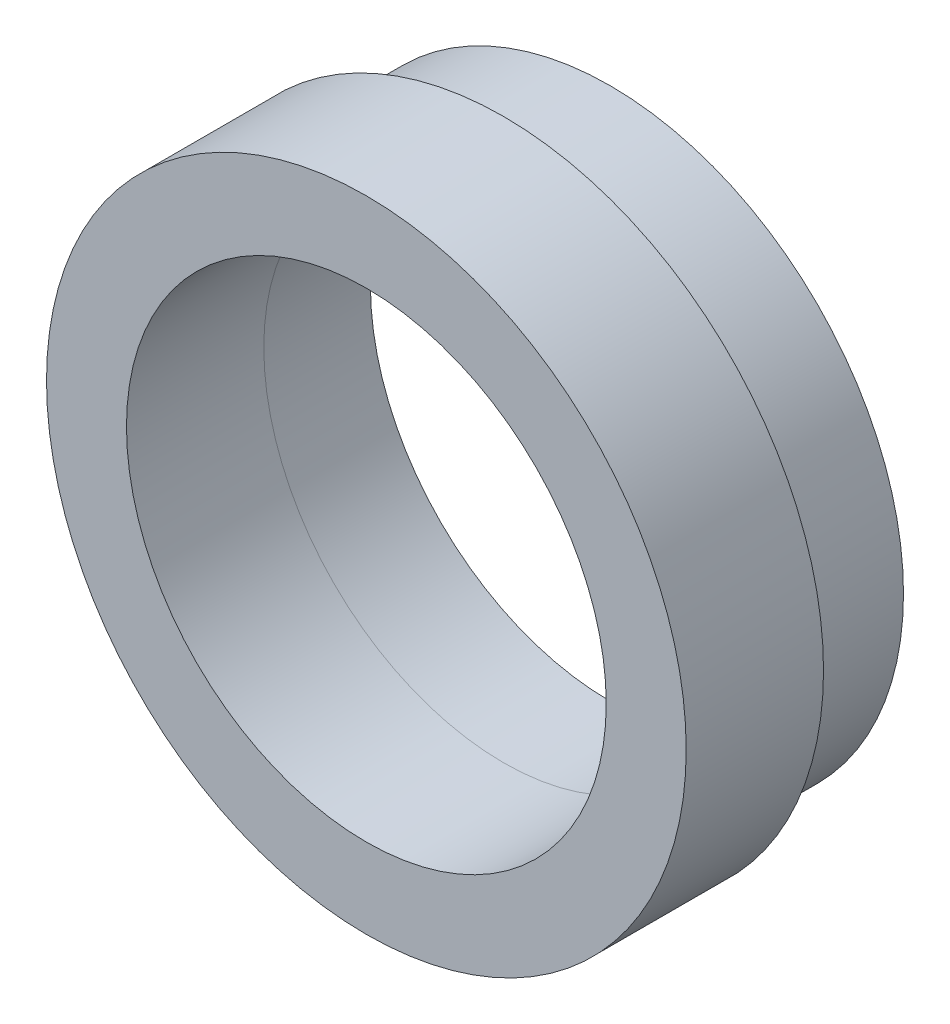
ISO-10303-21;
HEADER;
FILE_DESCRIPTION(('STEP AP214'),'2;1');
FILE_NAME('part.step','',(''),(''),'','','');
FILE_SCHEMA(('AUTOMOTIVE_DESIGN { 1 0 10303 214 1 1 1 1 }'));
ENDSEC;
DATA;
#1=APPLICATION_CONTEXT('core data for automotive mechanical design processes');
#2=APPLICATION_PROTOCOL_DEFINITION('international standard','automotive_design',2000,#1);
#3=PRODUCT_CONTEXT('',#1,'mechanical');
#4=PRODUCT('Part','Part','',(#3));
#5=PRODUCT_RELATED_PRODUCT_CATEGORY('part','',(#4));
#6=PRODUCT_DEFINITION_FORMATION('','',#4);
#7=PRODUCT_DEFINITION_CONTEXT('part definition',#1,'design');
#8=PRODUCT_DEFINITION('design','',#6,#7);
#9=PRODUCT_DEFINITION_SHAPE('','',#8);
#10=(LENGTH_UNIT() NAMED_UNIT(*) SI_UNIT(.MILLI.,.METRE.));
#11=(NAMED_UNIT(*) PLANE_ANGLE_UNIT() SI_UNIT($,.RADIAN.));
#12=(NAMED_UNIT(*) SI_UNIT($,.STERADIAN.) SOLID_ANGLE_UNIT());
#13=UNCERTAINTY_MEASURE_WITH_UNIT(LENGTH_MEASURE(1.E-05),#10,'distance_accuracy_value','');
#14=(GEOMETRIC_REPRESENTATION_CONTEXT(3) GLOBAL_UNCERTAINTY_ASSIGNED_CONTEXT((#13)) GLOBAL_UNIT_ASSIGNED_CONTEXT((#10,
#11,#12)) REPRESENTATION_CONTEXT('',''));
#15=CARTESIAN_POINT('',(0.,0.,0.));
#16=DIRECTION('',(0.,0.,1.));
#17=DIRECTION('',(1.,0.,0.));
#18=AXIS2_PLACEMENT_3D('',#15,#16,#17);
#19=CARTESIAN_POINT('',(0.,0.,-6.35));
#20=DIRECTION('',(0.,0.,-1.));
#21=DIRECTION('',(-1.,0.,0.));
#22=AXIS2_PLACEMENT_3D('',#19,#20,#21);
#23=PLANE('',#22);
#24=CARTESIAN_POINT('',(0.,0.,-6.35));
#25=DIRECTION('',(0.,0.,-1.));
#26=DIRECTION('',(-1.,0.,0.));
#27=AXIS2_PLACEMENT_3D('',#24,#25,#26);
#28=CIRCLE('',#27,17.4625);
#29=CARTESIAN_POINT('',(-17.4625,0.,-6.35));
#30=VERTEX_POINT('',#29);
#31=EDGE_CURVE('E12',#30,#30,#28,.T.);
#32=ORIENTED_EDGE('',*,*,#31,.T.);
#33=EDGE_LOOP('',(#32));
#34=FACE_BOUND('',#33,.T.);
#35=CARTESIAN_POINT('',(0.,0.,-6.35));
#36=DIRECTION('',(0.,0.,-1.));
#37=DIRECTION('',(-1.,0.,0.));
#38=AXIS2_PLACEMENT_3D('',#35,#36,#37);
#39=CIRCLE('',#38,14.2875);
#40=CARTESIAN_POINT('',(-14.2875,0.,-6.35));
#41=VERTEX_POINT('',#40);
#42=EDGE_CURVE('E56',#41,#41,#39,.T.);
#43=ORIENTED_EDGE('',*,*,#42,.F.);
#44=EDGE_LOOP('',(#43));
#45=FACE_BOUND('',#44,.T.);
#46=ADVANCED_FACE('F45',(#34,#45),#23,.T.);
#47=CARTESIAN_POINT('',(0.,0.,0.));
#48=DIRECTION('',(0.,0.,-1.));
#49=DIRECTION('',(-1.,0.,0.));
#50=AXIS2_PLACEMENT_3D('',#47,#48,#49);
#51=PLANE('',#50);
#52=CARTESIAN_POINT('',(0.,0.,0.));
#53=DIRECTION('',(0.,0.,-1.));
#54=DIRECTION('',(-1.,0.,0.));
#55=AXIS2_PLACEMENT_3D('',#52,#53,#54);
#56=CIRCLE('',#55,17.4625);
#57=CARTESIAN_POINT('',(-17.4625,0.,0.));
#58=VERTEX_POINT('',#57);
#59=EDGE_CURVE('E49',#58,#58,#56,.T.);
#60=ORIENTED_EDGE('',*,*,#59,.F.);
#61=EDGE_LOOP('',(#60));
#62=FACE_BOUND('',#61,.T.);
#63=CARTESIAN_POINT('',(0.,0.,0.));
#64=DIRECTION('',(0.,0.,-1.));
#65=DIRECTION('',(-1.,0.,0.));
#66=AXIS2_PLACEMENT_3D('',#63,#64,#65);
#67=CIRCLE('',#66,14.2875);
#68=CARTESIAN_POINT('',(-14.2875,0.,0.));
#69=VERTEX_POINT('',#68);
#70=EDGE_CURVE('E58',#69,#69,#67,.T.);
#71=ORIENTED_EDGE('',*,*,#70,.T.);
#72=EDGE_LOOP('',(#71));
#73=FACE_BOUND('',#72,.T.);
#74=ADVANCED_FACE('F68',(#62,#73),#51,.F.);
#75=CARTESIAN_POINT('',(0.,0.,-6.35));
#76=DIRECTION('',(0.,0.,1.));
#77=DIRECTION('',(1.,0.,0.));
#78=AXIS2_PLACEMENT_3D('',#75,#76,#77);
#79=CYLINDRICAL_SURFACE('',#78,17.4625);
#80=ORIENTED_EDGE('',*,*,#31,.F.);
#81=EDGE_LOOP('',(#80));
#82=FACE_BOUND('',#81,.T.);
#83=ORIENTED_EDGE('',*,*,#59,.T.);
#84=EDGE_LOOP('',(#83));
#85=FACE_BOUND('',#84,.T.);
#86=ADVANCED_FACE('F47',(#82,#85),#79,.T.);
#87=CARTESIAN_POINT('',(0.,0.,-6.35));
#88=DIRECTION('',(0.,0.,1.));
#89=DIRECTION('',(1.,0.,0.));
#90=AXIS2_PLACEMENT_3D('',#87,#88,#89);
#91=CYLINDRICAL_SURFACE('',#90,14.2875);
#92=ORIENTED_EDGE('',*,*,#42,.T.);
#93=EDGE_LOOP('',(#92));
#94=FACE_BOUND('',#93,.T.);
#95=ORIENTED_EDGE('',*,*,#70,.F.);
#96=EDGE_LOOP('',(#95));
#97=FACE_BOUND('',#96,.T.);
#98=ADVANCED_FACE('F64',(#94,#97),#91,.F.);
#99=CLOSED_SHELL('',(#46,#74,#86,#98));
#100=MANIFOLD_SOLID_BREP('B2',#99);
#101=CARTESIAN_POINT('',(0.,0.,8.1788));
#102=DIRECTION('',(0.,0.,1.));
#103=DIRECTION('',(1.,0.,0.));
#104=AXIS2_PLACEMENT_3D('',#101,#102,#103);
#105=PLANE('',#104);
#106=CARTESIAN_POINT('',(0.,0.,8.1788));
#107=DIRECTION('',(0.,0.,1.));
#108=DIRECTION('',(1.,0.,0.));
#109=AXIS2_PLACEMENT_3D('',#106,#107,#108);
#110=CIRCLE('',#109,19.05);
#111=CARTESIAN_POINT('',(19.05,0.,8.1788));
#112=VERTEX_POINT('',#111);
#113=EDGE_CURVE('E44',#112,#112,#110,.T.);
#114=ORIENTED_EDGE('',*,*,#113,.T.);
#115=EDGE_LOOP('',(#114));
#116=FACE_BOUND('',#115,.T.);
#117=CARTESIAN_POINT('',(0.,0.,8.1788));
#118=DIRECTION('',(0.,0.,1.));
#119=DIRECTION('',(1.,0.,0.));
#120=AXIS2_PLACEMENT_3D('',#117,#118,#119);
#121=CIRCLE('',#120,14.2875);
#122=CARTESIAN_POINT('',(14.2875,0.,8.1788));
#123=VERTEX_POINT('',#122);
#124=EDGE_CURVE('E118',#123,#123,#121,.T.);
#125=ORIENTED_EDGE('',*,*,#124,.F.);
#126=EDGE_LOOP('',(#125));
#127=FACE_BOUND('',#126,.T.);
#128=ADVANCED_FACE('F107',(#116,#127),#105,.T.);
#129=CARTESIAN_POINT('',(0.,0.,0.));
#130=DIRECTION('',(0.,0.,1.));
#131=DIRECTION('',(1.,0.,0.));
#132=AXIS2_PLACEMENT_3D('',#129,#130,#131);
#133=PLANE('',#132);
#134=CARTESIAN_POINT('',(0.,0.,0.));
#135=DIRECTION('',(0.,0.,1.));
#136=DIRECTION('',(1.,0.,0.));
#137=AXIS2_PLACEMENT_3D('',#134,#135,#136);
#138=CIRCLE('',#137,19.05);
#139=CARTESIAN_POINT('',(19.05,0.,0.));
#140=VERTEX_POINT('',#139);
#141=EDGE_CURVE('E111',#140,#140,#138,.T.);
#142=ORIENTED_EDGE('',*,*,#141,.F.);
#143=EDGE_LOOP('',(#142));
#144=FACE_BOUND('',#143,.T.);
#145=CARTESIAN_POINT('',(0.,0.,0.));
#146=DIRECTION('',(0.,0.,1.));
#147=DIRECTION('',(1.,0.,0.));
#148=AXIS2_PLACEMENT_3D('',#145,#146,#147);
#149=CIRCLE('',#148,14.2875);
#150=CARTESIAN_POINT('',(14.2875,0.,0.));
#151=VERTEX_POINT('',#150);
#152=EDGE_CURVE('E120',#151,#151,#149,.T.);
#153=ORIENTED_EDGE('',*,*,#152,.T.);
#154=EDGE_LOOP('',(#153));
#155=FACE_BOUND('',#154,.T.);
#156=ADVANCED_FACE('F130',(#144,#155),#133,.F.);
#157=CARTESIAN_POINT('',(0.,0.,8.1788));
#158=DIRECTION('',(0.,0.,-1.));
#159=DIRECTION('',(-1.,0.,0.));
#160=AXIS2_PLACEMENT_3D('',#157,#158,#159);
#161=CYLINDRICAL_SURFACE('',#160,19.05);
#162=ORIENTED_EDGE('',*,*,#113,.F.);
#163=EDGE_LOOP('',(#162));
#164=FACE_BOUND('',#163,.T.);
#165=ORIENTED_EDGE('',*,*,#141,.T.);
#166=EDGE_LOOP('',(#165));
#167=FACE_BOUND('',#166,.T.);
#168=ADVANCED_FACE('F109',(#164,#167),#161,.T.);
#169=CARTESIAN_POINT('',(0.,0.,8.1788));
#170=DIRECTION('',(0.,0.,-1.));
#171=DIRECTION('',(-1.,0.,0.));
#172=AXIS2_PLACEMENT_3D('',#169,#170,#171);
#173=CYLINDRICAL_SURFACE('',#172,14.2875);
#174=ORIENTED_EDGE('',*,*,#124,.T.);
#175=EDGE_LOOP('',(#174));
#176=FACE_BOUND('',#175,.T.);
#177=ORIENTED_EDGE('',*,*,#152,.F.);
#178=EDGE_LOOP('',(#177));
#179=FACE_BOUND('',#178,.T.);
#180=ADVANCED_FACE('F126',(#176,#179),#173,.F.);
#181=CLOSED_SHELL('',(#128,#156,#168,#180));
#182=MANIFOLD_SOLID_BREP('B7',#181);
#183=ADVANCED_BREP_SHAPE_REPRESENTATION('',(#18,#100,#182),#14);
#184=SHAPE_DEFINITION_REPRESENTATION(#9,#183);
ENDSEC;
END-ISO-10303-21;
